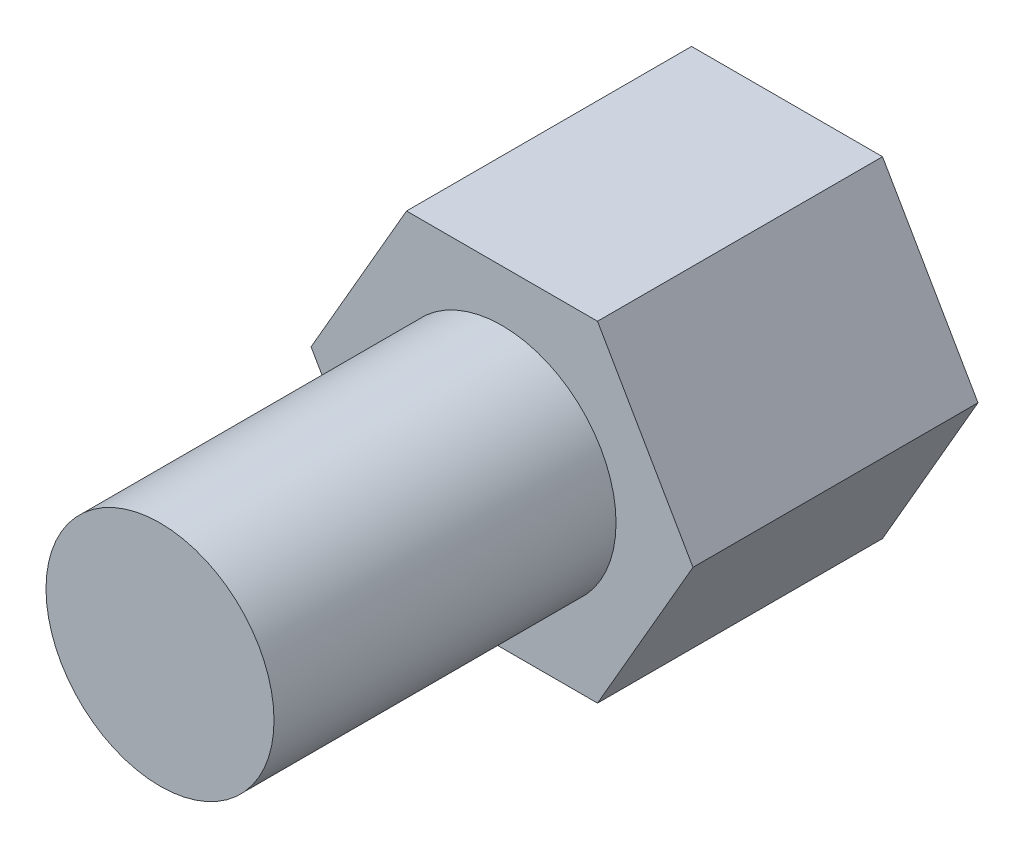
ISO-10303-21;
HEADER;
FILE_DESCRIPTION(('STEP AP214'),'2;1');
FILE_NAME('part.step','',(''),(''),'','','');
FILE_SCHEMA(('AUTOMOTIVE_DESIGN { 1 0 10303 214 1 1 1 1 }'));
ENDSEC;
DATA;
#1=APPLICATION_CONTEXT('core data for automotive mechanical design processes');
#2=APPLICATION_PROTOCOL_DEFINITION('international standard','automotive_design',2000,#1);
#3=PRODUCT_CONTEXT('',#1,'mechanical');
#4=PRODUCT('Part','Part','',(#3));
#5=PRODUCT_RELATED_PRODUCT_CATEGORY('part','',(#4));
#6=PRODUCT_DEFINITION_FORMATION('','',#4);
#7=PRODUCT_DEFINITION_CONTEXT('part definition',#1,'design');
#8=PRODUCT_DEFINITION('design','',#6,#7);
#9=PRODUCT_DEFINITION_SHAPE('','',#8);
#10=(LENGTH_UNIT() NAMED_UNIT(*) SI_UNIT(.MILLI.,.METRE.));
#11=(NAMED_UNIT(*) PLANE_ANGLE_UNIT() SI_UNIT($,.RADIAN.));
#12=(NAMED_UNIT(*) SI_UNIT($,.STERADIAN.) SOLID_ANGLE_UNIT());
#13=UNCERTAINTY_MEASURE_WITH_UNIT(LENGTH_MEASURE(1.E-05),#10,'distance_accuracy_value','');
#14=(GEOMETRIC_REPRESENTATION_CONTEXT(3) GLOBAL_UNCERTAINTY_ASSIGNED_CONTEXT((#13)) GLOBAL_UNIT_ASSIGNED_CONTEXT((#10,
#11,#12)) REPRESENTATION_CONTEXT('',''));
#15=CARTESIAN_POINT('',(0.,0.,0.));
#16=DIRECTION('',(0.,0.,1.));
#17=DIRECTION('',(1.,0.,0.));
#18=AXIS2_PLACEMENT_3D('',#15,#16,#17);
#19=CARTESIAN_POINT('',(1.675,2.90118510267787,5.));
#20=DIRECTION('',(0.,-1.,0.));
#21=DIRECTION('',(0.,0.,-1.));
#22=AXIS2_PLACEMENT_3D('',#19,#20,#21);
#23=PLANE('',#22);
#24=DIRECTION('',(-1.,0.,0.));
#25=VECTOR('',#24,1.);
#26=CARTESIAN_POINT('',(1.675,2.90118510267787,0.));
#27=LINE('',#26,#25);
#28=CARTESIAN_POINT('',(1.675,2.90118510267787,0.));
#29=VERTEX_POINT('',#28);
#30=CARTESIAN_POINT('',(-1.675,2.90118510267787,0.));
#31=VERTEX_POINT('',#30);
#32=EDGE_CURVE('E118',#29,#31,#27,.T.);
#33=ORIENTED_EDGE('',*,*,#32,.T.);
#34=DIRECTION('',(0.,0.,-1.));
#35=VECTOR('',#34,1.);
#36=CARTESIAN_POINT('',(-1.675,2.90118510267787,5.));
#37=LINE('',#36,#35);
#38=CARTESIAN_POINT('',(-1.675,2.90118510267787,5.));
#39=VERTEX_POINT('',#38);
#40=EDGE_CURVE('E35',#39,#31,#37,.T.);
#41=ORIENTED_EDGE('',*,*,#40,.F.);
#42=DIRECTION('',(-1.,0.,0.));
#43=VECTOR('',#42,1.);
#44=CARTESIAN_POINT('',(1.675,2.90118510267787,5.));
#45=LINE('',#44,#43);
#46=CARTESIAN_POINT('',(1.675,2.90118510267787,5.));
#47=VERTEX_POINT('',#46);
#48=EDGE_CURVE('E129',#47,#39,#45,.T.);
#49=ORIENTED_EDGE('',*,*,#48,.F.);
#50=DIRECTION('',(0.,0.,-1.));
#51=VECTOR('',#50,1.);
#52=CARTESIAN_POINT('',(1.675,2.90118510267787,5.));
#53=LINE('',#52,#51);
#54=EDGE_CURVE('E114',#47,#29,#53,.T.);
#55=ORIENTED_EDGE('',*,*,#54,.T.);
#56=EDGE_LOOP('',(#33,#41,#49,#55));
#57=FACE_BOUND('',#56,.T.);
#58=ADVANCED_FACE('F32',(#57),#23,.F.);
#59=CARTESIAN_POINT('',(-1.675,2.90118510267787,5.));
#60=DIRECTION('',(0.866025403784439,-0.5,0.));
#61=DIRECTION('',(0.5,0.866025403784439,0.));
#62=AXIS2_PLACEMENT_3D('',#59,#60,#61);
#63=PLANE('',#62);
#64=DIRECTION('',(-0.5,-0.866025403784439,0.));
#65=VECTOR('',#64,1.);
#66=CARTESIAN_POINT('',(-1.675,2.90118510267787,0.));
#67=LINE('',#66,#65);
#68=CARTESIAN_POINT('',(-3.35,0.,0.));
#69=VERTEX_POINT('',#68);
#70=EDGE_CURVE('E121',#31,#69,#67,.T.);
#71=ORIENTED_EDGE('',*,*,#70,.T.);
#72=DIRECTION('',(0.,0.,-1.));
#73=VECTOR('',#72,1.);
#74=CARTESIAN_POINT('',(-3.35,0.,5.));
#75=LINE('',#74,#73);
#76=CARTESIAN_POINT('',(-3.35,0.,5.));
#77=VERTEX_POINT('',#76);
#78=EDGE_CURVE('E132',#77,#69,#75,.T.);
#79=ORIENTED_EDGE('',*,*,#78,.F.);
#80=DIRECTION('',(-0.5,-0.866025403784439,0.));
#81=VECTOR('',#80,1.);
#82=CARTESIAN_POINT('',(-1.675,2.90118510267787,5.));
#83=LINE('',#82,#81);
#84=EDGE_CURVE('E87',#39,#77,#83,.T.);
#85=ORIENTED_EDGE('',*,*,#84,.F.);
#86=ORIENTED_EDGE('',*,*,#40,.T.);
#87=EDGE_LOOP('',(#71,#79,#85,#86));
#88=FACE_BOUND('',#87,.T.);
#89=ADVANCED_FACE('F137',(#88),#63,.F.);
#90=CARTESIAN_POINT('',(-3.35,0.,5.));
#91=DIRECTION('',(0.866025403784438,0.5,0.));
#92=DIRECTION('',(-0.5,0.866025403784438,0.));
#93=AXIS2_PLACEMENT_3D('',#90,#91,#92);
#94=PLANE('',#93);
#95=DIRECTION('',(0.5,-0.866025403784438,0.));
#96=VECTOR('',#95,1.);
#97=CARTESIAN_POINT('',(-3.35,0.,0.));
#98=LINE('',#97,#96);
#99=CARTESIAN_POINT('',(-1.675,-2.90118510267787,0.));
#100=VERTEX_POINT('',#99);
#101=EDGE_CURVE('E124',#69,#100,#98,.T.);
#102=ORIENTED_EDGE('',*,*,#101,.T.);
#103=DIRECTION('',(0.,0.,-1.));
#104=VECTOR('',#103,1.);
#105=CARTESIAN_POINT('',(-1.675,-2.90118510267787,5.));
#106=LINE('',#105,#104);
#107=CARTESIAN_POINT('',(-1.675,-2.90118510267787,5.));
#108=VERTEX_POINT('',#107);
#109=EDGE_CURVE('E109',#108,#100,#106,.T.);
#110=ORIENTED_EDGE('',*,*,#109,.F.);
#111=DIRECTION('',(0.5,-0.866025403784438,0.));
#112=VECTOR('',#111,1.);
#113=CARTESIAN_POINT('',(-3.35,0.,5.));
#114=LINE('',#113,#112);
#115=EDGE_CURVE('E100',#77,#108,#114,.T.);
#116=ORIENTED_EDGE('',*,*,#115,.F.);
#117=ORIENTED_EDGE('',*,*,#78,.T.);
#118=EDGE_LOOP('',(#102,#110,#116,#117));
#119=FACE_BOUND('',#118,.T.);
#120=ADVANCED_FACE('F143',(#119),#94,.F.);
#121=CARTESIAN_POINT('',(-1.675,-2.90118510267787,5.));
#122=DIRECTION('',(0.,1.,0.));
#123=DIRECTION('',(-1.,0.,0.));
#124=AXIS2_PLACEMENT_3D('',#121,#122,#123);
#125=PLANE('',#124);
#126=DIRECTION('',(1.,0.,0.));
#127=VECTOR('',#126,1.);
#128=CARTESIAN_POINT('',(-1.675,-2.90118510267787,0.));
#129=LINE('',#128,#127);
#130=CARTESIAN_POINT('',(1.675,-2.90118510267787,0.));
#131=VERTEX_POINT('',#130);
#132=EDGE_CURVE('E108',#100,#131,#129,.T.);
#133=ORIENTED_EDGE('',*,*,#132,.T.);
#134=DIRECTION('',(0.,0.,-1.));
#135=VECTOR('',#134,1.);
#136=CARTESIAN_POINT('',(1.675,-2.90118510267787,5.));
#137=LINE('',#136,#135);
#138=CARTESIAN_POINT('',(1.675,-2.90118510267787,5.));
#139=VERTEX_POINT('',#138);
#140=EDGE_CURVE('E105',#139,#131,#137,.T.);
#141=ORIENTED_EDGE('',*,*,#140,.F.);
#142=DIRECTION('',(1.,0.,0.));
#143=VECTOR('',#142,1.);
#144=CARTESIAN_POINT('',(-1.675,-2.90118510267787,5.));
#145=LINE('',#144,#143);
#146=EDGE_CURVE('E94',#108,#139,#145,.T.);
#147=ORIENTED_EDGE('',*,*,#146,.F.);
#148=ORIENTED_EDGE('',*,*,#109,.T.);
#149=EDGE_LOOP('',(#133,#141,#147,#148));
#150=FACE_BOUND('',#149,.T.);
#151=ADVANCED_FACE('F106',(#150),#125,.F.);
#152=CARTESIAN_POINT('',(1.675,-2.90118510267787,5.));
#153=DIRECTION('',(-0.866025403784439,0.5,0.));
#154=DIRECTION('',(-0.5,-0.866025403784439,0.));
#155=AXIS2_PLACEMENT_3D('',#152,#153,#154);
#156=PLANE('',#155);
#157=DIRECTION('',(0.5,0.866025403784439,0.));
#158=VECTOR('',#157,1.);
#159=CARTESIAN_POINT('',(1.675,-2.90118510267787,0.));
#160=LINE('',#159,#158);
#161=CARTESIAN_POINT('',(3.35,0.,0.));
#162=VERTEX_POINT('',#161);
#163=EDGE_CURVE('E72',#131,#162,#160,.T.);
#164=ORIENTED_EDGE('',*,*,#163,.T.);
#165=DIRECTION('',(0.,0.,-1.));
#166=VECTOR('',#165,1.);
#167=CARTESIAN_POINT('',(3.35,0.,5.));
#168=LINE('',#167,#166);
#169=CARTESIAN_POINT('',(3.35,0.,5.));
#170=VERTEX_POINT('',#169);
#171=EDGE_CURVE('E110',#170,#162,#168,.T.);
#172=ORIENTED_EDGE('',*,*,#171,.F.);
#173=DIRECTION('',(0.5,0.866025403784439,0.));
#174=VECTOR('',#173,1.);
#175=CARTESIAN_POINT('',(1.675,-2.90118510267787,5.));
#176=LINE('',#175,#174);
#177=EDGE_CURVE('E98',#139,#170,#176,.T.);
#178=ORIENTED_EDGE('',*,*,#177,.F.);
#179=ORIENTED_EDGE('',*,*,#140,.T.);
#180=EDGE_LOOP('',(#164,#172,#178,#179));
#181=FACE_BOUND('',#180,.T.);
#182=ADVANCED_FACE('F112',(#181),#156,.F.);
#183=CARTESIAN_POINT('',(3.35,0.,5.));
#184=DIRECTION('',(-0.866025403784438,-0.5,0.));
#185=DIRECTION('',(0.5,-0.866025403784439,0.));
#186=AXIS2_PLACEMENT_3D('',#183,#184,#185);
#187=PLANE('',#186);
#188=DIRECTION('',(-0.5,0.866025403784438,0.));
#189=VECTOR('',#188,1.);
#190=CARTESIAN_POINT('',(3.35,0.,0.));
#191=LINE('',#190,#189);
#192=EDGE_CURVE('E78',#162,#29,#191,.T.);
#193=ORIENTED_EDGE('',*,*,#192,.T.);
#194=ORIENTED_EDGE('',*,*,#54,.F.);
#195=DIRECTION('',(-0.5,0.866025403784438,0.));
#196=VECTOR('',#195,1.);
#197=CARTESIAN_POINT('',(3.35,0.,5.));
#198=LINE('',#197,#196);
#199=EDGE_CURVE('E49',#170,#47,#198,.T.);
#200=ORIENTED_EDGE('',*,*,#199,.F.);
#201=ORIENTED_EDGE('',*,*,#171,.T.);
#202=EDGE_LOOP('',(#193,#194,#200,#201));
#203=FACE_BOUND('',#202,.T.);
#204=ADVANCED_FACE('F174',(#203),#187,.F.);
#205=CARTESIAN_POINT('',(0.,0.,5.));
#206=DIRECTION('',(0.,0.,1.));
#207=DIRECTION('',(1.,0.,0.));
#208=AXIS2_PLACEMENT_3D('',#205,#206,#207);
#209=PLANE('',#208);
#210=CARTESIAN_POINT('',(0.,0.,5.));
#211=DIRECTION('',(0.,0.,1.));
#212=DIRECTION('',(1.,0.,0.));
#213=AXIS2_PLACEMENT_3D('',#210,#211,#212);
#214=CIRCLE('',#213,2.);
#215=CARTESIAN_POINT('',(2.,0.,5.));
#216=VERTEX_POINT('',#215);
#217=EDGE_CURVE('E11',#216,#216,#214,.T.);
#218=ORIENTED_EDGE('',*,*,#217,.F.);
#219=EDGE_LOOP('',(#218));
#220=FACE_BOUND('',#219,.T.);
#221=ORIENTED_EDGE('',*,*,#48,.T.);
#222=ORIENTED_EDGE('',*,*,#84,.T.);
#223=ORIENTED_EDGE('',*,*,#115,.T.);
#224=ORIENTED_EDGE('',*,*,#146,.T.);
#225=ORIENTED_EDGE('',*,*,#177,.T.);
#226=ORIENTED_EDGE('',*,*,#199,.T.);
#227=EDGE_LOOP('',(#221,#222,#223,#224,#225,#226));
#228=FACE_BOUND('',#227,.T.);
#229=ADVANCED_FACE('F96',(#220,#228),#209,.T.);
#230=CARTESIAN_POINT('',(0.,0.,0.));
#231=DIRECTION('',(0.,0.,1.));
#232=DIRECTION('',(1.,0.,0.));
#233=AXIS2_PLACEMENT_3D('',#230,#231,#232);
#234=PLANE('',#233);
#235=CARTESIAN_POINT('',(0.,0.,0.));
#236=DIRECTION('',(0.,0.,-1.));
#237=DIRECTION('',(-1.,0.,0.));
#238=AXIS2_PLACEMENT_3D('',#235,#236,#237);
#239=CIRCLE('',#238,1.65);
#240=CARTESIAN_POINT('',(-1.65,0.,0.));
#241=VERTEX_POINT('',#240);
#242=EDGE_CURVE('E150',#241,#241,#239,.T.);
#243=ORIENTED_EDGE('',*,*,#242,.F.);
#244=EDGE_LOOP('',(#243));
#245=FACE_BOUND('',#244,.T.);
#246=ORIENTED_EDGE('',*,*,#32,.F.);
#247=ORIENTED_EDGE('',*,*,#192,.F.);
#248=ORIENTED_EDGE('',*,*,#163,.F.);
#249=ORIENTED_EDGE('',*,*,#132,.F.);
#250=ORIENTED_EDGE('',*,*,#101,.F.);
#251=ORIENTED_EDGE('',*,*,#70,.F.);
#252=EDGE_LOOP('',(#246,#247,#248,#249,#250,#251));
#253=FACE_BOUND('',#252,.T.);
#254=ADVANCED_FACE('F142',(#245,#253),#234,.F.);
#255=CARTESIAN_POINT('',(0.,0.,11.));
#256=DIRECTION('',(0.,0.,-1.));
#257=DIRECTION('',(-1.,0.,0.));
#258=AXIS2_PLACEMENT_3D('',#255,#256,#257);
#259=CYLINDRICAL_SURFACE('',#258,2.);
#260=CARTESIAN_POINT('',(0.,0.,11.));
#261=DIRECTION('',(0.,0.,1.));
#262=DIRECTION('',(1.,0.,0.));
#263=AXIS2_PLACEMENT_3D('',#260,#261,#262);
#264=CIRCLE('',#263,2.);
#265=CARTESIAN_POINT('',(2.,0.,11.));
#266=VERTEX_POINT('',#265);
#267=EDGE_CURVE('E122',#266,#266,#264,.T.);
#268=ORIENTED_EDGE('',*,*,#267,.F.);
#269=EDGE_LOOP('',(#268));
#270=FACE_BOUND('',#269,.T.);
#271=ORIENTED_EDGE('',*,*,#217,.T.);
#272=EDGE_LOOP('',(#271));
#273=FACE_BOUND('',#272,.T.);
#274=ADVANCED_FACE('F166',(#270,#273),#259,.T.);
#275=CARTESIAN_POINT('',(0.,0.,11.));
#276=DIRECTION('',(0.,0.,1.));
#277=DIRECTION('',(1.,0.,0.));
#278=AXIS2_PLACEMENT_3D('',#275,#276,#277);
#279=PLANE('',#278);
#280=ORIENTED_EDGE('',*,*,#267,.T.);
#281=EDGE_LOOP('',(#280));
#282=FACE_BOUND('',#281,.T.);
#283=ADVANCED_FACE('F161',(#282),#279,.T.);
#284=CARTESIAN_POINT('',(0.,0.,3.));
#285=DIRECTION('',(0.,0.,-1.));
#286=DIRECTION('',(-1.,0.,0.));
#287=AXIS2_PLACEMENT_3D('',#284,#285,#286);
#288=CYLINDRICAL_SURFACE('',#287,1.65);
#289=CARTESIAN_POINT('',(0.,0.,3.));
#290=DIRECTION('',(0.,0.,-1.));
#291=DIRECTION('',(-1.,0.,0.));
#292=AXIS2_PLACEMENT_3D('',#289,#290,#291);
#293=CIRCLE('',#292,1.65);
#294=CARTESIAN_POINT('',(-1.65,0.,3.));
#295=VERTEX_POINT('',#294);
#296=EDGE_CURVE('E149',#295,#295,#293,.T.);
#297=ORIENTED_EDGE('',*,*,#296,.F.);
#298=EDGE_LOOP('',(#297));
#299=FACE_BOUND('',#298,.T.);
#300=ORIENTED_EDGE('',*,*,#242,.T.);
#301=EDGE_LOOP('',(#300));
#302=FACE_BOUND('',#301,.T.);
#303=ADVANCED_FACE('F158',(#299,#302),#288,.F.);
#304=CARTESIAN_POINT('',(0.,0.,3.));
#305=DIRECTION('',(0.,0.,-1.));
#306=DIRECTION('',(-1.,0.,0.));
#307=AXIS2_PLACEMENT_3D('',#304,#305,#306);
#308=PLANE('',#307);
#309=ORIENTED_EDGE('',*,*,#296,.T.);
#310=EDGE_LOOP('',(#309));
#311=FACE_BOUND('',#310,.T.);
#312=ADVANCED_FACE('F156',(#311),#308,.T.);
#313=CLOSED_SHELL('',(#58,#89,#120,#151,#182,#204,#229,#254,#274,#283,#303,#312));
#314=MANIFOLD_SOLID_BREP('B2',#313);
#315=ADVANCED_BREP_SHAPE_REPRESENTATION('',(#18,#314),#14);
#316=SHAPE_DEFINITION_REPRESENTATION(#9,#315);
ENDSEC;
END-ISO-10303-21;
